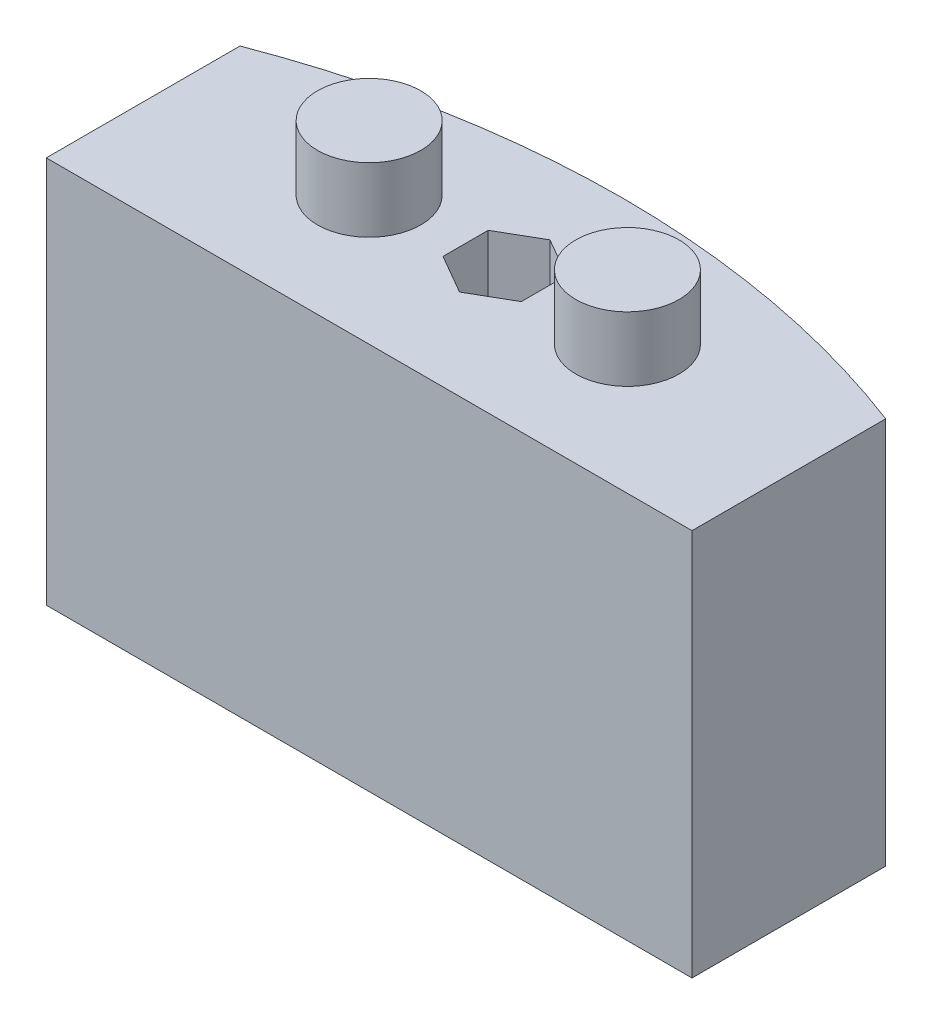
ISO-10303-21;
HEADER;
FILE_DESCRIPTION(('STEP AP214'),'2;1');
FILE_NAME('part.step','',(''),(''),'','','');
FILE_SCHEMA(('AUTOMOTIVE_DESIGN { 1 0 10303 214 1 1 1 1 }'));
ENDSEC;
DATA;
#1=APPLICATION_CONTEXT('core data for automotive mechanical design processes');
#2=APPLICATION_PROTOCOL_DEFINITION('international standard','automotive_design',2000,#1);
#3=PRODUCT_CONTEXT('',#1,'mechanical');
#4=PRODUCT('Part','Part','',(#3));
#5=PRODUCT_RELATED_PRODUCT_CATEGORY('part','',(#4));
#6=PRODUCT_DEFINITION_FORMATION('','',#4);
#7=PRODUCT_DEFINITION_CONTEXT('part definition',#1,'design');
#8=PRODUCT_DEFINITION('design','',#6,#7);
#9=PRODUCT_DEFINITION_SHAPE('','',#8);
#10=(LENGTH_UNIT() NAMED_UNIT(*) SI_UNIT(.MILLI.,.METRE.));
#11=(NAMED_UNIT(*) PLANE_ANGLE_UNIT() SI_UNIT($,.RADIAN.));
#12=(NAMED_UNIT(*) SI_UNIT($,.STERADIAN.) SOLID_ANGLE_UNIT());
#13=UNCERTAINTY_MEASURE_WITH_UNIT(LENGTH_MEASURE(1.E-05),#10,'distance_accuracy_value','');
#14=(GEOMETRIC_REPRESENTATION_CONTEXT(3) GLOBAL_UNCERTAINTY_ASSIGNED_CONTEXT((#13)) GLOBAL_UNIT_ASSIGNED_CONTEXT((#10,
#11,#12)) REPRESENTATION_CONTEXT('',''));
#15=CARTESIAN_POINT('',(0.,0.,0.));
#16=DIRECTION('',(0.,0.,1.));
#17=DIRECTION('',(1.,0.,0.));
#18=AXIS2_PLACEMENT_3D('',#15,#16,#17);
#19=CARTESIAN_POINT('',(0.,30.,0.));
#20=DIRECTION('',(0.,1.,0.));
#21=DIRECTION('',(0.,0.,1.));
#22=AXIS2_PLACEMENT_3D('',#19,#20,#21);
#23=PLANE('',#22);
#24=CARTESIAN_POINT('',(10.,30.,-10.));
#25=DIRECTION('',(0.,1.,0.));
#26=DIRECTION('',(0.,0.,1.));
#27=AXIS2_PLACEMENT_3D('',#24,#25,#26);
#28=CIRCLE('',#27,4.);
#29=CARTESIAN_POINT('',(10.,30.,-6.));
#30=VERTEX_POINT('',#29);
#31=EDGE_CURVE('E144',#30,#30,#28,.T.);
#32=ORIENTED_EDGE('',*,*,#31,.F.);
#33=EDGE_LOOP('',(#32));
#34=FACE_BOUND('',#33,.T.);
#35=CARTESIAN_POINT('',(-10.,30.,-10.));
#36=DIRECTION('',(0.,1.,0.));
#37=DIRECTION('',(0.,0.,1.));
#38=AXIS2_PLACEMENT_3D('',#35,#36,#37);
#39=CIRCLE('',#38,4.);
#40=CARTESIAN_POINT('',(-10.,30.,-6.));
#41=VERTEX_POINT('',#40);
#42=EDGE_CURVE('E155',#41,#41,#39,.T.);
#43=ORIENTED_EDGE('',*,*,#42,.F.);
#44=EDGE_LOOP('',(#43));
#45=FACE_BOUND('',#44,.T.);
#46=DIRECTION('',(0.,0.,-1.));
#47=VECTOR('',#46,1.);
#48=CARTESIAN_POINT('',(25.,30.,0.));
#49=LINE('',#48,#47);
#50=CARTESIAN_POINT('',(25.,30.,0.));
#51=VERTEX_POINT('',#50);
#52=CARTESIAN_POINT('',(25.,30.,-15.));
#53=VERTEX_POINT('',#52);
#54=EDGE_CURVE('E163',#51,#53,#49,.T.);
#55=ORIENTED_EDGE('',*,*,#54,.T.);
#56=CARTESIAN_POINT('',(0.,30.,50.3834841531101));
#57=DIRECTION('',(0.,1.,0.));
#58=DIRECTION('',(0.,0.,1.));
#59=AXIS2_PLACEMENT_3D('',#56,#57,#58);
#60=CIRCLE('',#59,70.);
#61=CARTESIAN_POINT('',(-25.,30.,-15.));
#62=VERTEX_POINT('',#61);
#63=EDGE_CURVE('E89',#53,#62,#60,.T.);
#64=ORIENTED_EDGE('',*,*,#63,.T.);
#65=DIRECTION('',(0.,0.,-1.));
#66=VECTOR('',#65,1.);
#67=CARTESIAN_POINT('',(-25.,30.,0.));
#68=LINE('',#67,#66);
#69=CARTESIAN_POINT('',(-25.,30.,0.));
#70=VERTEX_POINT('',#69);
#71=EDGE_CURVE('E166',#70,#62,#68,.T.);
#72=ORIENTED_EDGE('',*,*,#71,.F.);
#73=DIRECTION('',(1.,0.,0.));
#74=VECTOR('',#73,1.);
#75=CARTESIAN_POINT('',(0.,30.,0.));
#76=LINE('',#75,#74);
#77=EDGE_CURVE('E61',#70,#51,#76,.T.);
#78=ORIENTED_EDGE('',*,*,#77,.T.);
#79=EDGE_LOOP('',(#55,#64,#72,#78));
#80=FACE_BOUND('',#79,.T.);
#81=DIRECTION('',(0.,0.,1.));
#82=VECTOR('',#81,1.);
#83=CARTESIAN_POINT('',(3.03108891324552,30.,-12.25));
#84=LINE('',#83,#82);
#85=CARTESIAN_POINT('',(3.03108891324552,30.,-12.25));
#86=VERTEX_POINT('',#85);
#87=CARTESIAN_POINT('',(3.03108891324552,30.,-8.75000000000001));
#88=VERTEX_POINT('',#87);
#89=EDGE_CURVE('E139',#86,#88,#84,.T.);
#90=ORIENTED_EDGE('',*,*,#89,.T.);
#91=DIRECTION('',(-0.866025403784438,0.,0.500000000000001));
#92=VECTOR('',#91,1.);
#93=CARTESIAN_POINT('',(3.03108891324552,30.,-8.75000000000001));
#94=LINE('',#93,#92);
#95=CARTESIAN_POINT('',(0.,30.,-7.00000000000001));
#96=VERTEX_POINT('',#95);
#97=EDGE_CURVE('E52',#88,#96,#94,.T.);
#98=ORIENTED_EDGE('',*,*,#97,.T.);
#99=DIRECTION('',(-0.866025403784439,0.,-0.499999999999999));
#100=VECTOR('',#99,1.);
#101=CARTESIAN_POINT('',(0.,30.,-7.00000000000001));
#102=LINE('',#101,#100);
#103=CARTESIAN_POINT('',(-3.03108891324555,30.,-8.75000000000001));
#104=VERTEX_POINT('',#103);
#105=EDGE_CURVE('E143',#96,#104,#102,.T.);
#106=ORIENTED_EDGE('',*,*,#105,.T.);
#107=DIRECTION('',(0.,0.,-1.));
#108=VECTOR('',#107,1.);
#109=CARTESIAN_POINT('',(-3.03108891324555,30.,-8.75000000000001));
#110=LINE('',#109,#108);
#111=CARTESIAN_POINT('',(-3.03108891324555,30.,-12.25));
#112=VERTEX_POINT('',#111);
#113=EDGE_CURVE('E222',#104,#112,#110,.T.);
#114=ORIENTED_EDGE('',*,*,#113,.T.);
#115=DIRECTION('',(0.866025403784438,0.,-0.5));
#116=VECTOR('',#115,1.);
#117=CARTESIAN_POINT('',(-3.03108891324555,30.,-12.25));
#118=LINE('',#117,#116);
#119=CARTESIAN_POINT('',(0.,30.,-14.));
#120=VERTEX_POINT('',#119);
#121=EDGE_CURVE('E207',#112,#120,#118,.T.);
#122=ORIENTED_EDGE('',*,*,#121,.T.);
#123=DIRECTION('',(0.866025403784439,0.,0.499999999999999));
#124=VECTOR('',#123,1.);
#125=CARTESIAN_POINT('',(0.,30.,-14.));
#126=LINE('',#125,#124);
#127=EDGE_CURVE('E203',#120,#86,#126,.T.);
#128=ORIENTED_EDGE('',*,*,#127,.T.);
#129=EDGE_LOOP('',(#90,#98,#106,#114,#122,#128));
#130=FACE_BOUND('',#129,.T.);
#131=ADVANCED_FACE('F36',(#34,#45,#80,#130),#23,.T.);
#132=CARTESIAN_POINT('',(25.,30.,0.));
#133=DIRECTION('',(-1.,0.,0.));
#134=DIRECTION('',(0.,0.,1.));
#135=AXIS2_PLACEMENT_3D('',#132,#133,#134);
#136=PLANE('',#135);
#137=DIRECTION('',(0.,0.,-1.));
#138=VECTOR('',#137,1.);
#139=CARTESIAN_POINT('',(25.,0.,0.));
#140=LINE('',#139,#138);
#141=CARTESIAN_POINT('',(25.,0.,0.));
#142=VERTEX_POINT('',#141);
#143=CARTESIAN_POINT('',(25.,0.,-15.));
#144=VERTEX_POINT('',#143);
#145=EDGE_CURVE('E160',#142,#144,#140,.T.);
#146=ORIENTED_EDGE('',*,*,#145,.T.);
#147=DIRECTION('',(0.,-1.,0.));
#148=VECTOR('',#147,1.);
#149=CARTESIAN_POINT('',(25.,30.,-15.));
#150=LINE('',#149,#148);
#151=EDGE_CURVE('E11',#53,#144,#150,.T.);
#152=ORIENTED_EDGE('',*,*,#151,.F.);
#153=ORIENTED_EDGE('',*,*,#54,.F.);
#154=DIRECTION('',(0.,-1.,0.));
#155=VECTOR('',#154,1.);
#156=CARTESIAN_POINT('',(25.,30.,0.));
#157=LINE('',#156,#155);
#158=EDGE_CURVE('E170',#51,#142,#157,.T.);
#159=ORIENTED_EDGE('',*,*,#158,.T.);
#160=EDGE_LOOP('',(#146,#152,#153,#159));
#161=FACE_BOUND('',#160,.T.);
#162=ADVANCED_FACE('F38',(#161),#136,.F.);
#163=CARTESIAN_POINT('',(0.,30.,50.3834841531101));
#164=DIRECTION('',(0.,-1.,0.));
#165=DIRECTION('',(0.,0.,-1.));
#166=AXIS2_PLACEMENT_3D('',#163,#164,#165);
#167=CYLINDRICAL_SURFACE('',#166,70.);
#168=CARTESIAN_POINT('',(0.,0.,50.3834841531101));
#169=DIRECTION('',(0.,1.,0.));
#170=DIRECTION('',(0.,0.,1.));
#171=AXIS2_PLACEMENT_3D('',#168,#169,#170);
#172=CIRCLE('',#171,70.);
#173=CARTESIAN_POINT('',(-25.,0.,-15.));
#174=VERTEX_POINT('',#173);
#175=EDGE_CURVE('E173',#144,#174,#172,.T.);
#176=ORIENTED_EDGE('',*,*,#175,.T.);
#177=DIRECTION('',(0.,-1.,0.));
#178=VECTOR('',#177,1.);
#179=CARTESIAN_POINT('',(-25.,30.,-15.));
#180=LINE('',#179,#178);
#181=EDGE_CURVE('E45',#62,#174,#180,.T.);
#182=ORIENTED_EDGE('',*,*,#181,.F.);
#183=ORIENTED_EDGE('',*,*,#63,.F.);
#184=ORIENTED_EDGE('',*,*,#151,.T.);
#185=EDGE_LOOP('',(#176,#182,#183,#184));
#186=FACE_BOUND('',#185,.T.);
#187=ADVANCED_FACE('F186',(#186),#167,.T.);
#188=CARTESIAN_POINT('',(-25.,30.,0.));
#189=DIRECTION('',(-1.,0.,0.));
#190=DIRECTION('',(0.,0.,1.));
#191=AXIS2_PLACEMENT_3D('',#188,#189,#190);
#192=PLANE('',#191);
#193=DIRECTION('',(0.,0.,-1.));
#194=VECTOR('',#193,1.);
#195=CARTESIAN_POINT('',(-25.,0.,0.));
#196=LINE('',#195,#194);
#197=CARTESIAN_POINT('',(-25.,0.,0.));
#198=VERTEX_POINT('',#197);
#199=EDGE_CURVE('E176',#198,#174,#196,.T.);
#200=ORIENTED_EDGE('',*,*,#199,.F.);
#201=DIRECTION('',(0.,-1.,0.));
#202=VECTOR('',#201,1.);
#203=CARTESIAN_POINT('',(-25.,30.,0.));
#204=LINE('',#203,#202);
#205=EDGE_CURVE('E181',#70,#198,#204,.T.);
#206=ORIENTED_EDGE('',*,*,#205,.F.);
#207=ORIENTED_EDGE('',*,*,#71,.T.);
#208=ORIENTED_EDGE('',*,*,#181,.T.);
#209=EDGE_LOOP('',(#200,#206,#207,#208));
#210=FACE_BOUND('',#209,.T.);
#211=ADVANCED_FACE('F185',(#210),#192,.T.);
#212=CARTESIAN_POINT('',(0.,30.,0.));
#213=DIRECTION('',(0.,0.,-1.));
#214=DIRECTION('',(-1.,0.,0.));
#215=AXIS2_PLACEMENT_3D('',#212,#213,#214);
#216=PLANE('',#215);
#217=DIRECTION('',(1.,0.,0.));
#218=VECTOR('',#217,1.);
#219=CARTESIAN_POINT('',(0.,0.,0.));
#220=LINE('',#219,#218);
#221=EDGE_CURVE('E82',#198,#142,#220,.T.);
#222=ORIENTED_EDGE('',*,*,#221,.T.);
#223=ORIENTED_EDGE('',*,*,#158,.F.);
#224=ORIENTED_EDGE('',*,*,#77,.F.);
#225=ORIENTED_EDGE('',*,*,#205,.T.);
#226=EDGE_LOOP('',(#222,#223,#224,#225));
#227=FACE_BOUND('',#226,.T.);
#228=ADVANCED_FACE('F193',(#227),#216,.F.);
#229=CARTESIAN_POINT('',(0.,0.,0.));
#230=DIRECTION('',(0.,1.,0.));
#231=DIRECTION('',(0.,0.,1.));
#232=AXIS2_PLACEMENT_3D('',#229,#230,#231);
#233=PLANE('',#232);
#234=CARTESIAN_POINT('',(0.,0.,-10.5));
#235=DIRECTION('',(0.,-1.,0.));
#236=DIRECTION('',(0.,0.,-1.));
#237=AXIS2_PLACEMENT_3D('',#234,#235,#236);
#238=CIRCLE('',#237,1.25);
#239=CARTESIAN_POINT('',(0.,0.,-11.75));
#240=VERTEX_POINT('',#239);
#241=EDGE_CURVE('E236',#240,#240,#238,.T.);
#242=ORIENTED_EDGE('',*,*,#241,.F.);
#243=EDGE_LOOP('',(#242));
#244=FACE_BOUND('',#243,.T.);
#245=ORIENTED_EDGE('',*,*,#145,.F.);
#246=ORIENTED_EDGE('',*,*,#221,.F.);
#247=ORIENTED_EDGE('',*,*,#199,.T.);
#248=ORIENTED_EDGE('',*,*,#175,.F.);
#249=EDGE_LOOP('',(#245,#246,#247,#248));
#250=FACE_BOUND('',#249,.T.);
#251=ADVANCED_FACE('F190',(#244,#250),#233,.F.);
#252=CARTESIAN_POINT('',(-10.,35.,-10.));
#253=DIRECTION('',(0.,-1.,0.));
#254=DIRECTION('',(0.,0.,-1.));
#255=AXIS2_PLACEMENT_3D('',#252,#253,#254);
#256=CYLINDRICAL_SURFACE('',#255,4.);
#257=CARTESIAN_POINT('',(-10.,35.,-10.));
#258=DIRECTION('',(0.,1.,0.));
#259=DIRECTION('',(0.,0.,1.));
#260=AXIS2_PLACEMENT_3D('',#257,#258,#259);
#261=CIRCLE('',#260,4.);
#262=CARTESIAN_POINT('',(-10.,35.,-6.));
#263=VERTEX_POINT('',#262);
#264=EDGE_CURVE('E157',#263,#263,#261,.T.);
#265=ORIENTED_EDGE('',*,*,#264,.F.);
#266=EDGE_LOOP('',(#265));
#267=FACE_BOUND('',#266,.T.);
#268=ORIENTED_EDGE('',*,*,#42,.T.);
#269=EDGE_LOOP('',(#268));
#270=FACE_BOUND('',#269,.T.);
#271=ADVANCED_FACE('F278',(#267,#270),#256,.T.);
#272=CARTESIAN_POINT('',(-10.,35.,-10.));
#273=DIRECTION('',(0.,1.,0.));
#274=DIRECTION('',(0.,0.,1.));
#275=AXIS2_PLACEMENT_3D('',#272,#273,#274);
#276=PLANE('',#275);
#277=ORIENTED_EDGE('',*,*,#264,.T.);
#278=EDGE_LOOP('',(#277));
#279=FACE_BOUND('',#278,.T.);
#280=ADVANCED_FACE('F274',(#279),#276,.T.);
#281=CARTESIAN_POINT('',(10.,35.,-10.));
#282=DIRECTION('',(0.,-1.,0.));
#283=DIRECTION('',(0.,0.,-1.));
#284=AXIS2_PLACEMENT_3D('',#281,#282,#283);
#285=CYLINDRICAL_SURFACE('',#284,4.);
#286=CARTESIAN_POINT('',(10.,35.,-10.));
#287=DIRECTION('',(0.,1.,0.));
#288=DIRECTION('',(0.,0.,1.));
#289=AXIS2_PLACEMENT_3D('',#286,#287,#288);
#290=CIRCLE('',#289,4.);
#291=CARTESIAN_POINT('',(10.,35.,-6.));
#292=VERTEX_POINT('',#291);
#293=EDGE_CURVE('E148',#292,#292,#290,.T.);
#294=ORIENTED_EDGE('',*,*,#293,.F.);
#295=EDGE_LOOP('',(#294));
#296=FACE_BOUND('',#295,.T.);
#297=ORIENTED_EDGE('',*,*,#31,.T.);
#298=EDGE_LOOP('',(#297));
#299=FACE_BOUND('',#298,.T.);
#300=ADVANCED_FACE('F270',(#296,#299),#285,.T.);
#301=CARTESIAN_POINT('',(10.,35.,-10.));
#302=DIRECTION('',(0.,1.,0.));
#303=DIRECTION('',(0.,0.,1.));
#304=AXIS2_PLACEMENT_3D('',#301,#302,#303);
#305=PLANE('',#304);
#306=ORIENTED_EDGE('',*,*,#293,.T.);
#307=EDGE_LOOP('',(#306));
#308=FACE_BOUND('',#307,.T.);
#309=ADVANCED_FACE('F267',(#308),#305,.T.);
#310=CARTESIAN_POINT('',(3.03108891324552,3.,-8.75000000000001));
#311=DIRECTION('',(-0.500000000000001,0.,-0.866025403784438));
#312=DIRECTION('',(-0.866025403784438,0.,0.500000000000001));
#313=AXIS2_PLACEMENT_3D('',#310,#311,#312);
#314=PLANE('',#313);
#315=ORIENTED_EDGE('',*,*,#97,.F.);
#316=DIRECTION('',(0.,1.,0.));
#317=VECTOR('',#316,1.);
#318=CARTESIAN_POINT('',(3.03108891324552,3.,-8.75000000000001));
#319=LINE('',#318,#317);
#320=CARTESIAN_POINT('',(3.03108891324552,3.,-8.75000000000001));
#321=VERTEX_POINT('',#320);
#322=EDGE_CURVE('E138',#321,#88,#319,.T.);
#323=ORIENTED_EDGE('',*,*,#322,.F.);
#324=DIRECTION('',(-0.866025403784438,0.,0.500000000000001));
#325=VECTOR('',#324,1.);
#326=CARTESIAN_POINT('',(3.03108891324552,3.,-8.75000000000001));
#327=LINE('',#326,#325);
#328=CARTESIAN_POINT('',(0.,3.,-7.00000000000001));
#329=VERTEX_POINT('',#328);
#330=EDGE_CURVE('E129',#321,#329,#327,.T.);
#331=ORIENTED_EDGE('',*,*,#330,.T.);
#332=DIRECTION('',(0.,1.,0.));
#333=VECTOR('',#332,1.);
#334=CARTESIAN_POINT('',(0.,3.,-7.00000000000001));
#335=LINE('',#334,#333);
#336=EDGE_CURVE('E137',#329,#96,#335,.T.);
#337=ORIENTED_EDGE('',*,*,#336,.T.);
#338=EDGE_LOOP('',(#315,#323,#331,#337));
#339=FACE_BOUND('',#338,.T.);
#340=ADVANCED_FACE('F136',(#339),#314,.T.);
#341=CARTESIAN_POINT('',(0.,3.,-7.00000000000001));
#342=DIRECTION('',(0.499999999999999,0.,-0.866025403784439));
#343=DIRECTION('',(-0.866025403784439,0.,-0.499999999999999));
#344=AXIS2_PLACEMENT_3D('',#341,#342,#343);
#345=PLANE('',#344);
#346=ORIENTED_EDGE('',*,*,#105,.F.);
#347=ORIENTED_EDGE('',*,*,#336,.F.);
#348=DIRECTION('',(-0.866025403784439,0.,-0.499999999999999));
#349=VECTOR('',#348,1.);
#350=CARTESIAN_POINT('',(0.,3.,-7.00000000000001));
#351=LINE('',#350,#349);
#352=CARTESIAN_POINT('',(-3.03108891324555,3.,-8.75000000000001));
#353=VERTEX_POINT('',#352);
#354=EDGE_CURVE('E125',#329,#353,#351,.T.);
#355=ORIENTED_EDGE('',*,*,#354,.T.);
#356=DIRECTION('',(0.,1.,0.));
#357=VECTOR('',#356,1.);
#358=CARTESIAN_POINT('',(-3.03108891324555,3.,-8.75000000000001));
#359=LINE('',#358,#357);
#360=EDGE_CURVE('E145',#353,#104,#359,.T.);
#361=ORIENTED_EDGE('',*,*,#360,.T.);
#362=EDGE_LOOP('',(#346,#347,#355,#361));
#363=FACE_BOUND('',#362,.T.);
#364=ADVANCED_FACE('F141',(#363),#345,.T.);
#365=CARTESIAN_POINT('',(-3.03108891324555,3.,-8.75000000000001));
#366=DIRECTION('',(1.,0.,0.));
#367=DIRECTION('',(0.,0.,-1.));
#368=AXIS2_PLACEMENT_3D('',#365,#366,#367);
#369=PLANE('',#368);
#370=ORIENTED_EDGE('',*,*,#113,.F.);
#371=ORIENTED_EDGE('',*,*,#360,.F.);
#372=DIRECTION('',(0.,0.,-1.));
#373=VECTOR('',#372,1.);
#374=CARTESIAN_POINT('',(-3.03108891324555,3.,-8.75000000000001));
#375=LINE('',#374,#373);
#376=CARTESIAN_POINT('',(-3.03108891324555,3.,-12.25));
#377=VERTEX_POINT('',#376);
#378=EDGE_CURVE('E131',#353,#377,#375,.T.);
#379=ORIENTED_EDGE('',*,*,#378,.T.);
#380=DIRECTION('',(0.,1.,0.));
#381=VECTOR('',#380,1.);
#382=CARTESIAN_POINT('',(-3.03108891324555,3.,-12.25));
#383=LINE('',#382,#381);
#384=EDGE_CURVE('E150',#377,#112,#383,.T.);
#385=ORIENTED_EDGE('',*,*,#384,.T.);
#386=EDGE_LOOP('',(#370,#371,#379,#385));
#387=FACE_BOUND('',#386,.T.);
#388=ADVANCED_FACE('F220',(#387),#369,.T.);
#389=CARTESIAN_POINT('',(-3.03108891324555,3.,-12.25));
#390=DIRECTION('',(0.5,0.,0.866025403784439));
#391=DIRECTION('',(0.866025403784439,0.,-0.5));
#392=AXIS2_PLACEMENT_3D('',#389,#390,#391);
#393=PLANE('',#392);
#394=ORIENTED_EDGE('',*,*,#121,.F.);
#395=ORIENTED_EDGE('',*,*,#384,.F.);
#396=DIRECTION('',(0.866025403784438,0.,-0.5));
#397=VECTOR('',#396,1.);
#398=CARTESIAN_POINT('',(-3.03108891324555,3.,-12.25));
#399=LINE('',#398,#397);
#400=CARTESIAN_POINT('',(0.,3.,-14.));
#401=VERTEX_POINT('',#400);
#402=EDGE_CURVE('E233',#377,#401,#399,.T.);
#403=ORIENTED_EDGE('',*,*,#402,.T.);
#404=DIRECTION('',(0.,1.,0.));
#405=VECTOR('',#404,1.);
#406=CARTESIAN_POINT('',(0.,3.,-14.));
#407=LINE('',#406,#405);
#408=EDGE_CURVE('E215',#401,#120,#407,.T.);
#409=ORIENTED_EDGE('',*,*,#408,.T.);
#410=EDGE_LOOP('',(#394,#395,#403,#409));
#411=FACE_BOUND('',#410,.T.);
#412=ADVANCED_FACE('F224',(#411),#393,.T.);
#413=CARTESIAN_POINT('',(0.,3.,-14.));
#414=DIRECTION('',(-0.499999999999999,0.,0.866025403784439));
#415=DIRECTION('',(0.866025403784439,0.,0.499999999999999));
#416=AXIS2_PLACEMENT_3D('',#413,#414,#415);
#417=PLANE('',#416);
#418=ORIENTED_EDGE('',*,*,#127,.F.);
#419=ORIENTED_EDGE('',*,*,#408,.F.);
#420=DIRECTION('',(0.866025403784439,0.,0.499999999999999));
#421=VECTOR('',#420,1.);
#422=CARTESIAN_POINT('',(0.,3.,-14.));
#423=LINE('',#422,#421);
#424=CARTESIAN_POINT('',(3.03108891324552,3.,-12.25));
#425=VERTEX_POINT('',#424);
#426=EDGE_CURVE('E231',#401,#425,#423,.T.);
#427=ORIENTED_EDGE('',*,*,#426,.T.);
#428=DIRECTION('',(0.,1.,0.));
#429=VECTOR('',#428,1.);
#430=CARTESIAN_POINT('',(3.03108891324552,3.,-12.25));
#431=LINE('',#430,#429);
#432=EDGE_CURVE('E212',#425,#86,#431,.T.);
#433=ORIENTED_EDGE('',*,*,#432,.T.);
#434=EDGE_LOOP('',(#418,#419,#427,#433));
#435=FACE_BOUND('',#434,.T.);
#436=ADVANCED_FACE('F255',(#435),#417,.T.);
#437=CARTESIAN_POINT('',(3.03108891324552,3.,-12.25));
#438=DIRECTION('',(-1.,0.,0.));
#439=DIRECTION('',(0.,0.,1.));
#440=AXIS2_PLACEMENT_3D('',#437,#438,#439);
#441=PLANE('',#440);
#442=ORIENTED_EDGE('',*,*,#89,.F.);
#443=ORIENTED_EDGE('',*,*,#432,.F.);
#444=DIRECTION('',(0.,0.,1.));
#445=VECTOR('',#444,1.);
#446=CARTESIAN_POINT('',(3.03108891324552,3.,-12.25));
#447=LINE('',#446,#445);
#448=EDGE_CURVE('E213',#425,#321,#447,.T.);
#449=ORIENTED_EDGE('',*,*,#448,.T.);
#450=ORIENTED_EDGE('',*,*,#322,.T.);
#451=EDGE_LOOP('',(#442,#443,#449,#450));
#452=FACE_BOUND('',#451,.T.);
#453=ADVANCED_FACE('F250',(#452),#441,.T.);
#454=CARTESIAN_POINT('',(0.,3.,0.));
#455=DIRECTION('',(0.,-1.,0.));
#456=DIRECTION('',(0.,0.,-1.));
#457=AXIS2_PLACEMENT_3D('',#454,#455,#456);
#458=PLANE('',#457);
#459=CARTESIAN_POINT('',(0.,3.,-10.5));
#460=DIRECTION('',(0.,-1.,0.));
#461=DIRECTION('',(0.,0.,-1.));
#462=AXIS2_PLACEMENT_3D('',#459,#460,#461);
#463=CIRCLE('',#462,1.25);
#464=CARTESIAN_POINT('',(0.,3.,-11.75));
#465=VERTEX_POINT('',#464);
#466=EDGE_CURVE('E40',#465,#465,#463,.T.);
#467=ORIENTED_EDGE('',*,*,#466,.T.);
#468=EDGE_LOOP('',(#467));
#469=FACE_BOUND('',#468,.T.);
#470=ORIENTED_EDGE('',*,*,#330,.F.);
#471=ORIENTED_EDGE('',*,*,#448,.F.);
#472=ORIENTED_EDGE('',*,*,#426,.F.);
#473=ORIENTED_EDGE('',*,*,#402,.F.);
#474=ORIENTED_EDGE('',*,*,#378,.F.);
#475=ORIENTED_EDGE('',*,*,#354,.F.);
#476=EDGE_LOOP('',(#470,#471,#472,#473,#474,#475));
#477=FACE_BOUND('',#476,.T.);
#478=ADVANCED_FACE('F127',(#469,#477),#458,.F.);
#479=CARTESIAN_POINT('',(0.,10.,-10.5));
#480=DIRECTION('',(0.,-1.,0.));
#481=DIRECTION('',(0.,0.,-1.));
#482=AXIS2_PLACEMENT_3D('',#479,#480,#481);
#483=CYLINDRICAL_SURFACE('',#482,1.25);
#484=ORIENTED_EDGE('',*,*,#241,.T.);
#485=EDGE_LOOP('',(#484));
#486=FACE_BOUND('',#485,.T.);
#487=ORIENTED_EDGE('',*,*,#466,.F.);
#488=EDGE_LOOP('',(#487));
#489=FACE_BOUND('',#488,.T.);
#490=ADVANCED_FACE('F244',(#486,#489),#483,.F.);
#491=CLOSED_SHELL('',(#131,#162,#187,#211,#228,#251,#271,#280,#300,#309,#340,#364,#388,#412,
#436,#453,#478,#490));
#492=MANIFOLD_SOLID_BREP('B2',#491);
#493=ADVANCED_BREP_SHAPE_REPRESENTATION('',(#18,#492),#14);
#494=SHAPE_DEFINITION_REPRESENTATION(#9,#493);
ENDSEC;
END-ISO-10303-21;
